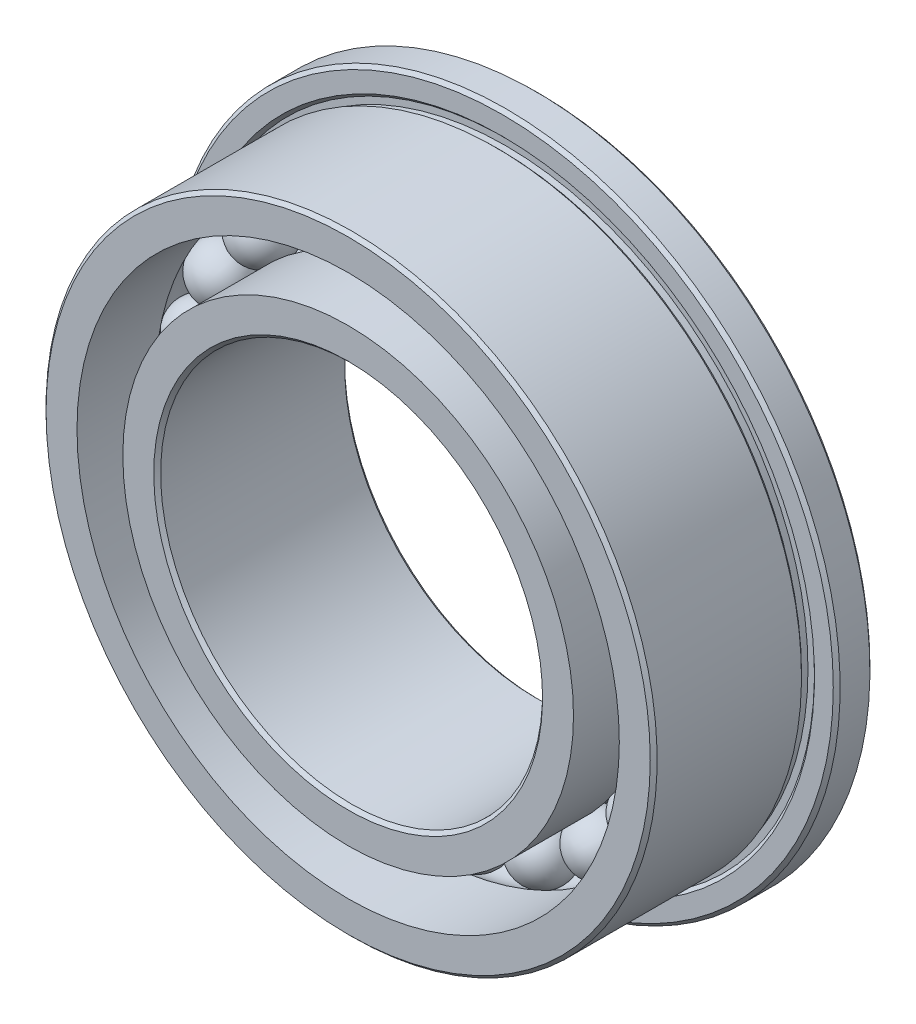
ISO-10303-21;
HEADER;
FILE_DESCRIPTION(('STEP AP214'),'2;1');
FILE_NAME('part.step','',(''),(''),'','','');
FILE_SCHEMA(('AUTOMOTIVE_DESIGN { 1 0 10303 214 1 1 1 1 }'));
ENDSEC;
DATA;
#1=APPLICATION_CONTEXT('core data for automotive mechanical design processes');
#2=APPLICATION_PROTOCOL_DEFINITION('international standard','automotive_design',2000,#1);
#3=PRODUCT_CONTEXT('',#1,'mechanical');
#4=PRODUCT('Part','Part','',(#3));
#5=PRODUCT_RELATED_PRODUCT_CATEGORY('part','',(#4));
#6=PRODUCT_DEFINITION_FORMATION('','',#4);
#7=PRODUCT_DEFINITION_CONTEXT('part definition',#1,'design');
#8=PRODUCT_DEFINITION('design','',#6,#7);
#9=PRODUCT_DEFINITION_SHAPE('','',#8);
#10=(LENGTH_UNIT() NAMED_UNIT(*) SI_UNIT(.MILLI.,.METRE.));
#11=(NAMED_UNIT(*) PLANE_ANGLE_UNIT() SI_UNIT($,.RADIAN.));
#12=(NAMED_UNIT(*) SI_UNIT($,.STERADIAN.) SOLID_ANGLE_UNIT());
#13=UNCERTAINTY_MEASURE_WITH_UNIT(LENGTH_MEASURE(1.E-05),#10,'distance_accuracy_value','');
#14=(GEOMETRIC_REPRESENTATION_CONTEXT(3) GLOBAL_UNCERTAINTY_ASSIGNED_CONTEXT((#13)) GLOBAL_UNIT_ASSIGNED_CONTEXT((#10,
#11,#12)) REPRESENTATION_CONTEXT('',''));
#15=CARTESIAN_POINT('',(0.,0.,0.));
#16=DIRECTION('',(0.,0.,1.));
#17=DIRECTION('',(1.,0.,0.));
#18=AXIS2_PLACEMENT_3D('',#15,#16,#17);
#19=CARTESIAN_POINT('',(-1.39198271618821,4.96805137941007,0.));
#20=DIRECTION('',(-0.269796771157012,0.962917287347803,0.));
#21=DIRECTION('',(0.962917287347803,0.269796771157012,0.));
#22=AXIS2_PLACEMENT_3D('',#19,#20,#21);
#23=SPHERICAL_SURFACE('',#22,0.5953125);
#24=CARTESIAN_POINT('',(-1.55259610651762,5.54128807703431,0.));
#25=VERTEX_POINT('',#24);
#26=VERTEX_LOOP('',#25);
#27=FACE_BOUND('',#26,.T.);
#28=ADVANCED_FACE('F48',(#27),#23,.T.);
#29=CLOSED_SHELL('',(#28));
#30=MANIFOLD_SOLID_BREP('B2',#29);
#31=CARTESIAN_POINT('',(-2.68072844221401,4.40827011533207,0.));
#32=DIRECTION('',(-0.519583950035423,0.854419404546495,0.));
#33=DIRECTION('',(0.854419404546495,0.519583950035423,0.));
#34=AXIS2_PLACEMENT_3D('',#31,#32,#33);
#35=SPHERICAL_SURFACE('',#34,0.5953125);
#36=CARTESIAN_POINT('',(-2.99004326246947,4.91691666710116,0.));
#37=VERTEX_POINT('',#36);
#38=VERTEX_LOOP('',#37);
#39=FACE_BOUND('',#38,.T.);
#40=ADVANCED_FACE('F67',(#39),#35,.T.);
#41=CLOSED_SHELL('',(#40));
#42=MANIFOLD_SOLID_BREP('B7',#41);
#43=CARTESIAN_POINT('',(-3.77065680319741,3.52154762329379,0.));
#44=DIRECTION('',(-0.730835964278116,0.682553143218662,0.));
#45=DIRECTION('',(0.682553143218662,0.730835964278116,0.));
#46=AXIS2_PLACEMENT_3D('',#43,#44,#45);
#47=SPHERICAL_SURFACE('',#46,0.5953125);
#48=CARTESIAN_POINT('',(-4.20573258818172,3.92788004136615,0.));
#49=VERTEX_POINT('',#48);
#50=VERTEX_LOOP('',#49);
#51=FACE_BOUND('',#50,.T.);
#52=ADVANCED_FACE('F86',(#51),#47,.T.);
#53=CLOSED_SHELL('',(#52));
#54=MANIFOLD_SOLID_BREP('B44',#53);
#55=CARTESIAN_POINT('',(-4.58093279869473,2.37364805404421,0.));
#56=DIRECTION('',(-0.88788521840237,0.460065037731162,0.));
#57=DIRECTION('',(0.460065037731162,0.88788521840237,0.));
#58=AXIS2_PLACEMENT_3D('',#55,#56,#57);
#59=SPHERICAL_SURFACE('',#58,0.5953125);
#60=CARTESIAN_POINT('',(-5.10950196777489,2.64753052181855,0.));
#61=VERTEX_POINT('',#60);
#62=VERTEX_LOOP('',#61);
#63=FACE_BOUND('',#62,.T.);
#64=ADVANCED_FACE('F105',(#63),#59,.T.);
#65=CLOSED_SHELL('',(#64));
#66=MANIFOLD_SOLID_BREP('B63',#65);
#67=CARTESIAN_POINT('',(-5.05146196488597,1.04970586734349,0.));
#68=DIRECTION('',(-0.979084087682321,0.203456013052645,0.));
#69=DIRECTION('',(0.203456013052645,0.979084087682321,0.));
#70=AXIS2_PLACEMENT_3D('',#67,#68,#69);
#71=SPHERICAL_SURFACE('',#70,0.5953125);
#72=CARTESIAN_POINT('',(-5.63432296083436,1.17082577511389,0.));
#73=VERTEX_POINT('',#72);
#74=VERTEX_LOOP('',#73);
#75=FACE_BOUND('',#74,.T.);
#76=ADVANCED_FACE('F124',(#75),#71,.T.);
#77=CLOSED_SHELL('',(#76));
#78=MANIFOLD_SOLID_BREP('B82',#77);
#79=CARTESIAN_POINT('',(-5.14734730604244,-0.352088201453296,0.));
#80=DIRECTION('',(-0.99766876919054,-0.0682424133646608,0.));
#81=DIRECTION('',(-0.0682424133646608,0.99766876919054,0.));
#82=AXIS2_PLACEMENT_3D('',#79,#80,#81);
#83=SPHERICAL_SURFACE('',#82,0.5953125);
#84=CARTESIAN_POINT('',(-5.74127199520119,-0.392713763159446,0.));
#85=VERTEX_POINT('',#84);
#86=VERTEX_LOOP('',#85);
#87=FACE_BOUND('',#86,.T.);
#88=ADVANCED_FACE('F144',(#87),#83,.T.);
#89=CLOSED_SHELL('',(#88));
#90=MANIFOLD_SOLID_BREP('B101',#89);
#91=CARTESIAN_POINT('',(-4.86147744505681,-1.72776949904464,0.));
#92=DIRECTION('',(-0.942260922118824,-0.334879612170977,0.));
#93=DIRECTION('',(-0.334879612170977,0.942260922118824,0.));
#94=AXIS2_PLACEMENT_3D('',#91,#92,#93);
#95=SPHERICAL_SURFACE('',#94,0.5953125);
#96=CARTESIAN_POINT('',(-5.42241715025567,-1.92712751816517,0.));
#97=VERTEX_POINT('',#96);
#98=VERTEX_LOOP('',#97);
#99=FACE_BOUND('',#98,.T.);
#100=ADVANCED_FACE('F163',(#99),#95,.T.);
#101=CLOSED_SHELL('',(#100));
#102=MANIFOLD_SOLID_BREP('B120',#101);
#103=CARTESIAN_POINT('',(-4.21505404175078,-2.97531003691136,0.));
#104=DIRECTION('',(-0.816969893010447,-0.57668032211486,0.));
#105=DIRECTION('',(-0.57668032211486,0.816969893010447,0.));
#106=AXIS2_PLACEMENT_3D('',#103,#104,#105);
#107=SPHERICAL_SURFACE('',#106,0.5953125);
#108=CARTESIAN_POINT('',(-4.70140643118356,-3.31861504117036,0.));
#109=VERTEX_POINT('',#108);
#110=VERTEX_LOOP('',#109);
#111=FACE_BOUND('',#110,.T.);
#112=ADVANCED_FACE('F183',(#111),#107,.T.);
#113=CLOSED_SHELL('',(#112));
#114=MANIFOLD_SOLID_BREP('B140',#113);
#115=CARTESIAN_POINT('',(-3.25601936275726,-4.00218544047809,0.));
#116=DIRECTION('',(-0.631087944326059,-0.775711290704415,0.));
#117=DIRECTION('',(-0.775711290704415,0.631087944326059,0.));
#118=AXIS2_PLACEMENT_3D('',#115,#116,#117);
#119=SPHERICAL_SURFACE('',#118,0.5953125);
#120=CARTESIAN_POINT('',(-3.63171390461387,-4.46397606822556,0.));
#121=VERTEX_POINT('',#120);
#122=VERTEX_LOOP('',#121);
#123=FACE_BOUND('',#122,.T.);
#124=ADVANCED_FACE('F202',(#123),#119,.T.);
#125=CLOSED_SHELL('',(#124));
#126=MANIFOLD_SOLID_BREP('B159',#125);
#127=CARTESIAN_POINT('',(-2.05550062292549,-4.73223705870468,0.));
#128=DIRECTION('',(-0.398401089846249,-0.91721130150545,0.));
#129=DIRECTION('',(-0.91721130150545,0.398401089846249,0.));
#130=AXIS2_PLACEMENT_3D('',#127,#128,#129);
#131=SPHERICAL_SURFACE('',#130,0.5953125);
#132=CARTESIAN_POINT('',(-2.29267377172458,-5.27826441163215,0.));
#133=VERTEX_POINT('',#132);
#134=VERTEX_LOOP('',#133);
#135=FACE_BOUND('',#134,.T.);
#136=ADVANCED_FACE('F221',(#135),#131,.T.);
#137=CLOSED_SHELL('',(#136));
#138=MANIFOLD_SOLID_BREP('B179',#137);
#139=CARTESIAN_POINT('',(-0.702534805180985,-5.11132030283119,0.));
#140=DIRECTION('',(-0.136166649096254,-0.99068594603633,0.));
#141=DIRECTION('',(-0.99068594603633,0.136166649096254,0.));
#142=AXIS2_PLACEMENT_3D('',#139,#140,#141);
#143=SPHERICAL_SURFACE('',#142,0.5953125);
#144=CARTESIAN_POINT('',(-0.783596513471099,-5.70108803008094,0.));
#145=VERTEX_POINT('',#144);
#146=VERTEX_LOOP('',#145);
#147=FACE_BOUND('',#146,.T.);
#148=ADVANCED_FACE('F241',(#147),#143,.T.);
#149=CLOSED_SHELL('',(#148));
#150=MANIFOLD_SOLID_BREP('B198',#149);
#151=CARTESIAN_POINT('',(0.702534805180913,-5.1113203028312,0.));
#152=DIRECTION('',(0.13616664909624,-0.990685946036332,0.));
#153=DIRECTION('',(-0.990685946036332,-0.13616664909624,0.));
#154=AXIS2_PLACEMENT_3D('',#151,#152,#153);
#155=SPHERICAL_SURFACE('',#154,0.5953125);
#156=CARTESIAN_POINT('',(0.783596513471019,-5.70108803008095,0.));
#157=VERTEX_POINT('',#156);
#158=VERTEX_LOOP('',#157);
#159=FACE_BOUND('',#158,.T.);
#160=ADVANCED_FACE('F260',(#159),#155,.T.);
#161=CLOSED_SHELL('',(#160));
#162=MANIFOLD_SOLID_BREP('B217',#161);
#163=CARTESIAN_POINT('',(2.05550062292542,-4.73223705870471,0.));
#164=DIRECTION('',(0.398401089846236,-0.917211301505455,0.));
#165=DIRECTION('',(-0.917211301505455,-0.398401089846236,0.));
#166=AXIS2_PLACEMENT_3D('',#163,#164,#165);
#167=SPHERICAL_SURFACE('',#166,0.5953125);
#168=CARTESIAN_POINT('',(2.29267377172451,-5.27826441163218,0.));
#169=VERTEX_POINT('',#168);
#170=VERTEX_LOOP('',#169);
#171=FACE_BOUND('',#170,.T.);
#172=ADVANCED_FACE('F279',(#171),#167,.T.);
#173=CLOSED_SHELL('',(#172));
#174=MANIFOLD_SOLID_BREP('B237',#173);
#175=CARTESIAN_POINT('',(3.25601936275721,-4.00218544047813,0.));
#176=DIRECTION('',(0.631087944326049,-0.775711290704423,0.));
#177=DIRECTION('',(-0.775711290704423,-0.631087944326049,0.));
#178=AXIS2_PLACEMENT_3D('',#175,#176,#177);
#179=SPHERICAL_SURFACE('',#178,0.5953125);
#180=CARTESIAN_POINT('',(3.63171390461381,-4.46397606822561,0.));
#181=VERTEX_POINT('',#180);
#182=VERTEX_LOOP('',#181);
#183=FACE_BOUND('',#182,.T.);
#184=ADVANCED_FACE('F298',(#183),#179,.T.);
#185=CLOSED_SHELL('',(#184));
#186=MANIFOLD_SOLID_BREP('B256',#185);
#187=CARTESIAN_POINT('',(4.21505404175073,-2.97531003691141,0.));
#188=DIRECTION('',(0.816969893010439,-0.576680322114871,0.));
#189=DIRECTION('',(-0.576680322114871,-0.816969893010439,0.));
#190=AXIS2_PLACEMENT_3D('',#187,#188,#189);
#191=SPHERICAL_SURFACE('',#190,0.5953125);
#192=CARTESIAN_POINT('',(4.70140643118351,-3.31861504117042,0.));
#193=VERTEX_POINT('',#192);
#194=VERTEX_LOOP('',#193);
#195=FACE_BOUND('',#194,.T.);
#196=ADVANCED_FACE('F317',(#195),#191,.T.);
#197=CLOSED_SHELL('',(#196));
#198=MANIFOLD_SOLID_BREP('B275',#197);
#199=CARTESIAN_POINT('',(4.86147744505678,-1.7277694990447,0.));
#200=DIRECTION('',(0.942260922118819,-0.33487961217099,0.));
#201=DIRECTION('',(-0.33487961217099,-0.942260922118819,0.));
#202=AXIS2_PLACEMENT_3D('',#199,#200,#201);
#203=SPHERICAL_SURFACE('',#202,0.5953125);
#204=CARTESIAN_POINT('',(5.42241715025564,-1.92712751816524,0.));
#205=VERTEX_POINT('',#204);
#206=VERTEX_LOOP('',#205);
#207=FACE_BOUND('',#206,.T.);
#208=ADVANCED_FACE('F336',(#207),#203,.T.);
#209=CLOSED_SHELL('',(#208));
#210=MANIFOLD_SOLID_BREP('B294',#209);
#211=CARTESIAN_POINT('',(5.14734730604244,-0.352088201453368,0.));
#212=DIRECTION('',(0.997668769190539,-0.0682424133646746,0.));
#213=DIRECTION('',(-0.0682424133646746,-0.997668769190539,0.));
#214=AXIS2_PLACEMENT_3D('',#211,#212,#213);
#215=SPHERICAL_SURFACE('',#214,0.5953125);
#216=CARTESIAN_POINT('',(5.74127199520118,-0.392713763159526,0.));
#217=VERTEX_POINT('',#216);
#218=VERTEX_LOOP('',#217);
#219=FACE_BOUND('',#218,.T.);
#220=ADVANCED_FACE('F355',(#219),#215,.T.);
#221=CLOSED_SHELL('',(#220));
#222=MANIFOLD_SOLID_BREP('B313',#221);
#223=CARTESIAN_POINT('',(5.05146196488599,1.04970586734342,0.));
#224=DIRECTION('',(0.979084087682323,0.203456013052631,0.));
#225=DIRECTION('',(0.203456013052631,-0.979084087682323,0.));
#226=AXIS2_PLACEMENT_3D('',#223,#224,#225);
#227=SPHERICAL_SURFACE('',#226,0.5953125);
#228=CARTESIAN_POINT('',(5.63432296083437,1.17082577511381,0.));
#229=VERTEX_POINT('',#228);
#230=VERTEX_LOOP('',#229);
#231=FACE_BOUND('',#230,.T.);
#232=ADVANCED_FACE('F374',(#231),#227,.T.);
#233=CLOSED_SHELL('',(#232));
#234=MANIFOLD_SOLID_BREP('B332',#233);
#235=CARTESIAN_POINT('',(4.58093279869476,2.37364805404415,0.));
#236=DIRECTION('',(0.887885218402376,0.46006503773115,0.));
#237=DIRECTION('',(0.46006503773115,-0.887885218402376,0.));
#238=AXIS2_PLACEMENT_3D('',#235,#236,#237);
#239=SPHERICAL_SURFACE('',#238,0.5953125);
#240=CARTESIAN_POINT('',(5.10950196777492,2.64753052181848,0.));
#241=VERTEX_POINT('',#240);
#242=VERTEX_LOOP('',#241);
#243=FACE_BOUND('',#242,.T.);
#244=ADVANCED_FACE('F393',(#243),#239,.T.);
#245=CLOSED_SHELL('',(#244));
#246=MANIFOLD_SOLID_BREP('B351',#245);
#247=CARTESIAN_POINT('',(3.77065680319745,3.52154762329374,0.));
#248=DIRECTION('',(0.730835964278125,0.682553143218653,0.));
#249=DIRECTION('',(0.682553143218653,-0.730835964278125,0.));
#250=AXIS2_PLACEMENT_3D('',#247,#248,#249);
#251=SPHERICAL_SURFACE('',#250,0.5953125);
#252=CARTESIAN_POINT('',(4.20573258818178,3.92788004136609,0.));
#253=VERTEX_POINT('',#252);
#254=VERTEX_LOOP('',#253);
#255=FACE_BOUND('',#254,.T.);
#256=ADVANCED_FACE('F412',(#255),#251,.T.);
#257=CLOSED_SHELL('',(#256));
#258=MANIFOLD_SOLID_BREP('B370',#257);
#259=CARTESIAN_POINT('',(2.68072844221407,4.40827011533204,0.));
#260=DIRECTION('',(0.519583950035434,0.854419404546488,0.));
#261=DIRECTION('',(0.854419404546488,-0.519583950035434,0.));
#262=AXIS2_PLACEMENT_3D('',#259,#260,#261);
#263=SPHERICAL_SURFACE('',#262,0.5953125);
#264=CARTESIAN_POINT('',(2.99004326246954,4.91691666710112,0.));
#265=VERTEX_POINT('',#264);
#266=VERTEX_LOOP('',#265);
#267=FACE_BOUND('',#266,.T.);
#268=ADVANCED_FACE('F431',(#267),#263,.T.);
#269=CLOSED_SHELL('',(#268));
#270=MANIFOLD_SOLID_BREP('B389',#269);
#271=CARTESIAN_POINT('',(1.39198271618827,4.96805137941005,0.));
#272=DIRECTION('',(0.269796771157025,0.962917287347799,0.));
#273=DIRECTION('',(0.962917287347799,-0.269796771157025,0.));
#274=AXIS2_PLACEMENT_3D('',#271,#272,#273);
#275=SPHERICAL_SURFACE('',#274,0.5953125);
#276=CARTESIAN_POINT('',(1.55259610651769,5.54128807703429,0.));
#277=VERTEX_POINT('',#276);
#278=VERTEX_LOOP('',#277);
#279=FACE_BOUND('',#278,.T.);
#280=ADVANCED_FACE('F450',(#279),#275,.T.);
#281=CLOSED_SHELL('',(#280));
#282=MANIFOLD_SOLID_BREP('B408',#281);
#283=CARTESIAN_POINT('',(0.,5.159375,0.));
#284=DIRECTION('',(0.,1.,0.));
#285=DIRECTION('',(1.,0.,0.));
#286=AXIS2_PLACEMENT_3D('',#283,#284,#285);
#287=SPHERICAL_SURFACE('',#286,0.5953125);
#288=CARTESIAN_POINT('',(0.,5.7546875,0.));
#289=VERTEX_POINT('',#288);
#290=VERTEX_LOOP('',#289);
#291=FACE_BOUND('',#290,.T.);
#292=ADVANCED_FACE('F473',(#291),#287,.T.);
#293=CLOSED_SHELL('',(#292));
#294=MANIFOLD_SOLID_BREP('B427',#293);
#295=CARTESIAN_POINT('',(0.,0.,0.));
#296=DIRECTION('',(0.,0.,1.));
#297=DIRECTION('',(0.,-1.,0.));
#298=AXIS2_PLACEMENT_3D('',#295,#296,#297);
#299=CYLINDRICAL_SURFACE('',#298,4.683125);
#300=CARTESIAN_POINT('',(0.,0.,-0.3571875));
#301=DIRECTION('',(0.,0.,1.));
#302=DIRECTION('',(0.,-1.,0.));
#303=AXIS2_PLACEMENT_3D('',#300,#301,#302);
#304=CIRCLE('',#303,4.683125);
#305=CARTESIAN_POINT('',(0.,-4.683125,-0.3571875));
#306=VERTEX_POINT('',#305);
#307=EDGE_CURVE('E520',#306,#306,#304,.T.);
#308=ORIENTED_EDGE('',*,*,#307,.F.);
#309=EDGE_LOOP('',(#308));
#310=FACE_BOUND('',#309,.T.);
#311=CARTESIAN_POINT('',(0.,0.,-1.984375));
#312=DIRECTION('',(0.,0.,1.));
#313=DIRECTION('',(0.,-1.,0.));
#314=AXIS2_PLACEMENT_3D('',#311,#312,#313);
#315=CIRCLE('',#314,4.683125);
#316=CARTESIAN_POINT('',(0.,-4.683125,-1.984375));
#317=VERTEX_POINT('',#316);
#318=EDGE_CURVE('E531',#317,#317,#315,.T.);
#319=ORIENTED_EDGE('',*,*,#318,.T.);
#320=EDGE_LOOP('',(#319));
#321=FACE_BOUND('',#320,.T.);
#322=ADVANCED_FACE('F495',(#310,#321),#299,.T.);
#323=CARTESIAN_POINT('',(0.,0.,0.));
#324=DIRECTION('',(0.,0.,1.));
#325=DIRECTION('',(0.,-1.,0.));
#326=AXIS2_PLACEMENT_3D('',#323,#324,#325);
#327=TOROIDAL_SURFACE('',#326,5.159375,0.5953125);
#328=CARTESIAN_POINT('',(0.,0.,0.3571875));
#329=DIRECTION('',(0.,0.,1.));
#330=DIRECTION('',(0.,-1.,0.));
#331=AXIS2_PLACEMENT_3D('',#328,#329,#330);
#332=CIRCLE('',#331,4.683125);
#333=CARTESIAN_POINT('',(0.,-4.683125,0.357187499999999));
#334=VERTEX_POINT('',#333);
#335=EDGE_CURVE('E524',#334,#334,#332,.T.);
#336=ORIENTED_EDGE('',*,*,#335,.F.);
#337=EDGE_LOOP('',(#336));
#338=FACE_BOUND('',#337,.T.);
#339=ORIENTED_EDGE('',*,*,#307,.T.);
#340=EDGE_LOOP('',(#339));
#341=FACE_BOUND('',#340,.T.);
#342=ADVANCED_FACE('F551',(#338,#341),#327,.F.);
#343=CARTESIAN_POINT('',(0.,0.,0.));
#344=DIRECTION('',(0.,0.,1.));
#345=DIRECTION('',(0.,-1.,0.));
#346=AXIS2_PLACEMENT_3D('',#343,#344,#345);
#347=CYLINDRICAL_SURFACE('',#346,4.683125);
#348=CARTESIAN_POINT('',(0.,0.,1.984375));
#349=DIRECTION('',(0.,0.,1.));
#350=DIRECTION('',(0.,-1.,0.));
#351=AXIS2_PLACEMENT_3D('',#348,#349,#350);
#352=CIRCLE('',#351,4.683125);
#353=CARTESIAN_POINT('',(0.,-4.683125,1.984375));
#354=VERTEX_POINT('',#353);
#355=EDGE_CURVE('E528',#354,#354,#352,.T.);
#356=ORIENTED_EDGE('',*,*,#355,.F.);
#357=EDGE_LOOP('',(#356));
#358=FACE_BOUND('',#357,.T.);
#359=ORIENTED_EDGE('',*,*,#335,.T.);
#360=EDGE_LOOP('',(#359));
#361=FACE_BOUND('',#360,.T.);
#362=ADVANCED_FACE('F557',(#358,#361),#347,.T.);
#363=CARTESIAN_POINT('',(0.,3.96875,1.984375));
#364=DIRECTION('',(0.,0.,-1.));
#365=DIRECTION('',(0.,1.,0.));
#366=AXIS2_PLACEMENT_3D('',#363,#364,#365);
#367=PLANE('',#366);
#368=CARTESIAN_POINT('',(0.,0.,1.984375));
#369=DIRECTION('',(0.,0.,-1.));
#370=DIRECTION('',(0.,1.,0.));
#371=AXIS2_PLACEMENT_3D('',#368,#369,#370);
#372=CIRCLE('',#371,4.0401875);
#373=CARTESIAN_POINT('',(0.,4.0401875,1.984375));
#374=VERTEX_POINT('',#373);
#375=EDGE_CURVE('E472',#374,#374,#372,.T.);
#376=ORIENTED_EDGE('',*,*,#375,.T.);
#377=EDGE_LOOP('',(#376));
#378=FACE_BOUND('',#377,.T.);
#379=ORIENTED_EDGE('',*,*,#355,.T.);
#380=EDGE_LOOP('',(#379));
#381=FACE_BOUND('',#380,.T.);
#382=ADVANCED_FACE('F548',(#378,#381),#367,.F.);
#383=CARTESIAN_POINT('',(0.,0.,0.));
#384=DIRECTION('',(0.,0.,1.));
#385=DIRECTION('',(0.,-1.,0.));
#386=AXIS2_PLACEMENT_3D('',#383,#384,#385);
#387=CYLINDRICAL_SURFACE('',#386,3.96875);
#388=CARTESIAN_POINT('',(0.,0.,-1.9129375));
#389=DIRECTION('',(0.,0.,1.));
#390=DIRECTION('',(0.,-1.,0.));
#391=AXIS2_PLACEMENT_3D('',#388,#389,#390);
#392=CIRCLE('',#391,3.96875);
#393=CARTESIAN_POINT('',(0.,-3.96875,-1.9129375));
#394=VERTEX_POINT('',#393);
#395=EDGE_CURVE('E503',#394,#394,#392,.F.);
#396=ORIENTED_EDGE('',*,*,#395,.T.);
#397=EDGE_LOOP('',(#396));
#398=FACE_BOUND('',#397,.T.);
#399=CARTESIAN_POINT('',(0.,0.,1.9129375));
#400=DIRECTION('',(0.,0.,-1.));
#401=DIRECTION('',(0.,1.,0.));
#402=AXIS2_PLACEMENT_3D('',#399,#400,#401);
#403=CIRCLE('',#402,3.96875);
#404=CARTESIAN_POINT('',(0.,3.96875,1.9129375));
#405=VERTEX_POINT('',#404);
#406=EDGE_CURVE('E510',#405,#405,#403,.F.);
#407=ORIENTED_EDGE('',*,*,#406,.T.);
#408=EDGE_LOOP('',(#407));
#409=FACE_BOUND('',#408,.T.);
#410=ADVANCED_FACE('F540',(#398,#409),#387,.F.);
#411=CARTESIAN_POINT('',(0.,4.683125,-1.984375));
#412=DIRECTION('',(0.,0.,1.));
#413=DIRECTION('',(0.,-1.,0.));
#414=AXIS2_PLACEMENT_3D('',#411,#412,#413);
#415=PLANE('',#414);
#416=CARTESIAN_POINT('',(0.,0.,-1.984375));
#417=DIRECTION('',(0.,0.,1.));
#418=DIRECTION('',(0.,-1.,0.));
#419=AXIS2_PLACEMENT_3D('',#416,#417,#418);
#420=CIRCLE('',#419,4.0401875);
#421=CARTESIAN_POINT('',(0.,-4.0401875,-1.984375));
#422=VERTEX_POINT('',#421);
#423=EDGE_CURVE('E515',#422,#422,#420,.T.);
#424=ORIENTED_EDGE('',*,*,#423,.T.);
#425=EDGE_LOOP('',(#424));
#426=FACE_BOUND('',#425,.T.);
#427=ORIENTED_EDGE('',*,*,#318,.F.);
#428=EDGE_LOOP('',(#427));
#429=FACE_BOUND('',#428,.T.);
#430=ADVANCED_FACE('F537',(#426,#429),#415,.F.);
#431=CARTESIAN_POINT('',(0.,0.,-1.984375));
#432=DIRECTION('',(0.,0.,-1.));
#433=DIRECTION('',(0.,1.,0.));
#434=AXIS2_PLACEMENT_3D('',#431,#432,#433);
#435=CONICAL_SURFACE('',#434,4.0401875,0.78539816339745);
#436=ORIENTED_EDGE('',*,*,#395,.F.);
#437=EDGE_LOOP('',(#436));
#438=FACE_BOUND('',#437,.T.);
#439=ORIENTED_EDGE('',*,*,#423,.F.);
#440=EDGE_LOOP('',(#439));
#441=FACE_BOUND('',#440,.T.);
#442=ADVANCED_FACE('F539',(#438,#441),#435,.F.);
#443=CARTESIAN_POINT('',(0.,0.,1.9129375));
#444=DIRECTION('',(0.,0.,1.));
#445=DIRECTION('',(0.,-1.,0.));
#446=AXIS2_PLACEMENT_3D('',#443,#444,#445);
#447=CONICAL_SURFACE('',#446,3.96875,0.78539816339745);
#448=ORIENTED_EDGE('',*,*,#375,.F.);
#449=EDGE_LOOP('',(#448));
#450=FACE_BOUND('',#449,.T.);
#451=ORIENTED_EDGE('',*,*,#406,.F.);
#452=EDGE_LOOP('',(#451));
#453=FACE_BOUND('',#452,.T.);
#454=ADVANCED_FACE('F497',(#450,#453),#447,.F.);
#455=CLOSED_SHELL('',(#322,#342,#362,#382,#410,#430,#442,#454));
#456=MANIFOLD_SOLID_BREP('B446',#455);
#457=CARTESIAN_POINT('',(0.,5.635625,-1.984375));
#458=DIRECTION('',(0.,0.,1.));
#459=DIRECTION('',(0.,-1.,0.));
#460=AXIS2_PLACEMENT_3D('',#457,#458,#459);
#461=PLANE('',#460);
#462=CARTESIAN_POINT('',(0.,0.,-1.984375));
#463=DIRECTION('',(0.,0.,1.));
#464=DIRECTION('',(0.,-1.,0.));
#465=AXIS2_PLACEMENT_3D('',#462,#463,#464);
#466=CIRCLE('',#465,6.8754625);
#467=CARTESIAN_POINT('',(0.,-6.8754625,-1.984375));
#468=VERTEX_POINT('',#467);
#469=EDGE_CURVE('E654',#468,#468,#466,.F.);
#470=ORIENTED_EDGE('',*,*,#469,.T.);
#471=EDGE_LOOP('',(#470));
#472=FACE_BOUND('',#471,.T.);
#473=CARTESIAN_POINT('',(0.,0.,-1.984375));
#474=DIRECTION('',(0.,0.,1.));
#475=DIRECTION('',(0.,-1.,0.));
#476=AXIS2_PLACEMENT_3D('',#473,#474,#475);
#477=CIRCLE('',#476,5.635625);
#478=CARTESIAN_POINT('',(0.,-5.635625,-1.984375));
#479=VERTEX_POINT('',#478);
#480=EDGE_CURVE('E667',#479,#479,#477,.T.);
#481=ORIENTED_EDGE('',*,*,#480,.T.);
#482=EDGE_LOOP('',(#481));
#483=FACE_BOUND('',#482,.T.);
#484=ADVANCED_FACE('F634',(#472,#483),#461,.F.);
#485=CARTESIAN_POINT('',(0.,0.,0.));
#486=DIRECTION('',(0.,0.,1.));
#487=DIRECTION('',(0.,-1.,0.));
#488=AXIS2_PLACEMENT_3D('',#485,#486,#487);
#489=CYLINDRICAL_SURFACE('',#488,5.635625);
#490=ORIENTED_EDGE('',*,*,#480,.F.);
#491=EDGE_LOOP('',(#490));
#492=FACE_BOUND('',#491,.T.);
#493=CARTESIAN_POINT('',(0.,0.,-0.3571875));
#494=DIRECTION('',(0.,0.,1.));
#495=DIRECTION('',(0.,-1.,0.));
#496=AXIS2_PLACEMENT_3D('',#493,#494,#495);
#497=CIRCLE('',#496,5.635625);
#498=CARTESIAN_POINT('',(0.,-5.635625,-0.3571875));
#499=VERTEX_POINT('',#498);
#500=EDGE_CURVE('E671',#499,#499,#497,.T.);
#501=ORIENTED_EDGE('',*,*,#500,.T.);
#502=EDGE_LOOP('',(#501));
#503=FACE_BOUND('',#502,.T.);
#504=ADVANCED_FACE('F721',(#492,#503),#489,.F.);
#505=CARTESIAN_POINT('',(0.,0.,0.));
#506=DIRECTION('',(0.,0.,1.));
#507=DIRECTION('',(0.,-1.,0.));
#508=AXIS2_PLACEMENT_3D('',#505,#506,#507);
#509=TOROIDAL_SURFACE('',#508,5.159375,0.5953125);
#510=ORIENTED_EDGE('',*,*,#500,.F.);
#511=EDGE_LOOP('',(#510));
#512=FACE_BOUND('',#511,.T.);
#513=CARTESIAN_POINT('',(0.,0.,0.3571875));
#514=DIRECTION('',(0.,0.,1.));
#515=DIRECTION('',(0.,-1.,0.));
#516=AXIS2_PLACEMENT_3D('',#513,#514,#515);
#517=CIRCLE('',#516,5.635625);
#518=CARTESIAN_POINT('',(0.,-5.635625,0.357187499999999));
#519=VERTEX_POINT('',#518);
#520=EDGE_CURVE('E675',#519,#519,#517,.T.);
#521=ORIENTED_EDGE('',*,*,#520,.T.);
#522=EDGE_LOOP('',(#521));
#523=FACE_BOUND('',#522,.T.);
#524=ADVANCED_FACE('F727',(#512,#523),#509,.F.);
#525=CARTESIAN_POINT('',(0.,0.,0.));
#526=DIRECTION('',(0.,0.,1.));
#527=DIRECTION('',(0.,-1.,0.));
#528=AXIS2_PLACEMENT_3D('',#525,#526,#527);
#529=CYLINDRICAL_SURFACE('',#528,5.635625);
#530=ORIENTED_EDGE('',*,*,#520,.F.);
#531=EDGE_LOOP('',(#530));
#532=FACE_BOUND('',#531,.T.);
#533=CARTESIAN_POINT('',(0.,0.,1.984375));
#534=DIRECTION('',(0.,0.,1.));
#535=DIRECTION('',(0.,-1.,0.));
#536=AXIS2_PLACEMENT_3D('',#533,#534,#535);
#537=CIRCLE('',#536,5.635625);
#538=CARTESIAN_POINT('',(0.,-5.635625,1.984375));
#539=VERTEX_POINT('',#538);
#540=EDGE_CURVE('E679',#539,#539,#537,.T.);
#541=ORIENTED_EDGE('',*,*,#540,.T.);
#542=EDGE_LOOP('',(#541));
#543=FACE_BOUND('',#542,.T.);
#544=ADVANCED_FACE('F807',(#532,#543),#529,.F.);
#545=CARTESIAN_POINT('',(0.,6.35,1.984375));
#546=DIRECTION('',(0.,0.,-1.));
#547=DIRECTION('',(0.,1.,0.));
#548=AXIS2_PLACEMENT_3D('',#545,#546,#547);
#549=PLANE('',#548);
#550=CARTESIAN_POINT('',(0.,0.,1.984375));
#551=DIRECTION('',(0.,0.,-1.));
#552=DIRECTION('',(0.,1.,0.));
#553=AXIS2_PLACEMENT_3D('',#550,#551,#552);
#554=CIRCLE('',#553,6.2785625);
#555=CARTESIAN_POINT('',(0.,6.2785625,1.984375));
#556=VERTEX_POINT('',#555);
#557=EDGE_CURVE('E642',#556,#556,#554,.F.);
#558=ORIENTED_EDGE('',*,*,#557,.T.);
#559=EDGE_LOOP('',(#558));
#560=FACE_BOUND('',#559,.T.);
#561=ORIENTED_EDGE('',*,*,#540,.F.);
#562=EDGE_LOOP('',(#561));
#563=FACE_BOUND('',#562,.T.);
#564=ADVANCED_FACE('F753',(#560,#563),#549,.F.);
#565=CARTESIAN_POINT('',(0.,0.,0.));
#566=DIRECTION('',(0.,0.,1.));
#567=DIRECTION('',(0.,-1.,0.));
#568=AXIS2_PLACEMENT_3D('',#565,#566,#567);
#569=CYLINDRICAL_SURFACE('',#568,6.35);
#570=CARTESIAN_POINT('',(0.,0.,1.9129375));
#571=DIRECTION('',(0.,0.,-1.));
#572=DIRECTION('',(0.,1.,0.));
#573=AXIS2_PLACEMENT_3D('',#570,#571,#572);
#574=CIRCLE('',#573,6.35);
#575=CARTESIAN_POINT('',(0.,6.35,1.9129375));
#576=VERTEX_POINT('',#575);
#577=EDGE_CURVE('E494',#576,#576,#574,.T.);
#578=ORIENTED_EDGE('',*,*,#577,.T.);
#579=EDGE_LOOP('',(#578));
#580=FACE_BOUND('',#579,.T.);
#581=CARTESIAN_POINT('',(0.,0.,-1.08767115818396));
#582=DIRECTION('',(0.,0.,1.));
#583=DIRECTION('',(0.,-1.,0.));
#584=AXIS2_PLACEMENT_3D('',#581,#582,#583);
#585=CIRCLE('',#584,6.35);
#586=CARTESIAN_POINT('',(0.,-6.35,-1.08767115818396));
#587=VERTEX_POINT('',#586);
#588=EDGE_CURVE('E682',#587,#587,#585,.T.);
#589=ORIENTED_EDGE('',*,*,#588,.T.);
#590=EDGE_LOOP('',(#589));
#591=FACE_BOUND('',#590,.T.);
#592=ADVANCED_FACE('F779',(#580,#591),#569,.T.);
#593=CARTESIAN_POINT('',(0.,0.,-1.15502307909198));
#594=DIRECTION('',(0.,0.,1.));
#595=DIRECTION('',(0.,-1.,0.));
#596=AXIS2_PLACEMENT_3D('',#593,#594,#595);
#597=CONICAL_SURFACE('',#596,6.28264807909198,0.785398163397444);
#598=ORIENTED_EDGE('',*,*,#588,.F.);
#599=EDGE_LOOP('',(#598));
#600=FACE_BOUND('',#599,.T.);
#601=CARTESIAN_POINT('',(0.,0.,-1.15502307909198));
#602=DIRECTION('',(0.,0.,1.));
#603=DIRECTION('',(0.,-1.,0.));
#604=AXIS2_PLACEMENT_3D('',#601,#602,#603);
#605=CIRCLE('',#604,6.28264807909198);
#606=CARTESIAN_POINT('',(0.,-6.28264807909198,-1.15502307909198));
#607=VERTEX_POINT('',#606);
#608=EDGE_CURVE('E686',#607,#607,#605,.T.);
#609=ORIENTED_EDGE('',*,*,#608,.T.);
#610=EDGE_LOOP('',(#609));
#611=FACE_BOUND('',#610,.T.);
#612=ADVANCED_FACE('F775',(#600,#611),#597,.T.);
#613=CARTESIAN_POINT('',(0.,0.,0.));
#614=DIRECTION('',(0.,0.,1.));
#615=DIRECTION('',(0.,-1.,0.));
#616=AXIS2_PLACEMENT_3D('',#613,#614,#615);
#617=CYLINDRICAL_SURFACE('',#616,6.28264807909198);
#618=ORIENTED_EDGE('',*,*,#608,.F.);
#619=EDGE_LOOP('',(#618));
#620=FACE_BOUND('',#619,.T.);
#621=CARTESIAN_POINT('',(0.,0.,-1.28972692090802));
#622=DIRECTION('',(0.,0.,1.));
#623=DIRECTION('',(0.,-1.,0.));
#624=AXIS2_PLACEMENT_3D('',#621,#622,#623);
#625=CIRCLE('',#624,6.28264807909198);
#626=CARTESIAN_POINT('',(0.,-6.28264807909198,-1.28972692090802));
#627=VERTEX_POINT('',#626);
#628=EDGE_CURVE('E690',#627,#627,#625,.T.);
#629=ORIENTED_EDGE('',*,*,#628,.T.);
#630=EDGE_LOOP('',(#629));
#631=FACE_BOUND('',#630,.T.);
#632=ADVANCED_FACE('F766',(#620,#631),#617,.T.);
#633=CARTESIAN_POINT('',(0.,6.41735192090802,-1.28972692090802));
#634=DIRECTION('',(0.,0.,-1.));
#635=DIRECTION('',(0.,1.,0.));
#636=AXIS2_PLACEMENT_3D('',#633,#634,#635);
#637=PLANE('',#636);
#638=ORIENTED_EDGE('',*,*,#628,.F.);
#639=EDGE_LOOP('',(#638));
#640=FACE_BOUND('',#639,.T.);
#641=CARTESIAN_POINT('',(0.,0.,-1.28972692090802));
#642=DIRECTION('',(0.,0.,1.));
#643=DIRECTION('',(0.,-1.,0.));
#644=AXIS2_PLACEMENT_3D('',#641,#642,#643);
#645=CIRCLE('',#644,6.41735192090802);
#646=CARTESIAN_POINT('',(0.,-6.41735192090802,-1.28972692090802));
#647=VERTEX_POINT('',#646);
#648=EDGE_CURVE('E694',#647,#647,#645,.T.);
#649=ORIENTED_EDGE('',*,*,#648,.T.);
#650=EDGE_LOOP('',(#649));
#651=FACE_BOUND('',#650,.T.);
#652=ADVANCED_FACE('F717',(#640,#651),#637,.F.);
#653=CARTESIAN_POINT('',(0.,0.,-1.222375));
#654=DIRECTION('',(0.,0.,1.));
#655=DIRECTION('',(0.,-1.,0.));
#656=AXIS2_PLACEMENT_3D('',#653,#654,#655);
#657=CONICAL_SURFACE('',#656,6.48470384181604,0.785398163397448);
#658=ORIENTED_EDGE('',*,*,#648,.F.);
#659=EDGE_LOOP('',(#658));
#660=FACE_BOUND('',#659,.T.);
#661=CARTESIAN_POINT('',(0.,0.,-1.222375));
#662=DIRECTION('',(0.,0.,1.));
#663=DIRECTION('',(0.,-1.,0.));
#664=AXIS2_PLACEMENT_3D('',#661,#662,#663);
#665=CIRCLE('',#664,6.48470384181604);
#666=CARTESIAN_POINT('',(0.,-6.48470384181604,-1.222375));
#667=VERTEX_POINT('',#666);
#668=EDGE_CURVE('E698',#667,#667,#665,.T.);
#669=ORIENTED_EDGE('',*,*,#668,.T.);
#670=EDGE_LOOP('',(#669));
#671=FACE_BOUND('',#670,.T.);
#672=ADVANCED_FACE('F703',(#660,#671),#657,.F.);
#673=CARTESIAN_POINT('',(0.,6.9469,-1.222375));
#674=DIRECTION('',(0.,0.,-1.));
#675=DIRECTION('',(0.,1.,0.));
#676=AXIS2_PLACEMENT_3D('',#673,#674,#675);
#677=PLANE('',#676);
#678=CARTESIAN_POINT('',(0.,0.,-1.222375));
#679=DIRECTION('',(0.,0.,-1.));
#680=DIRECTION('',(0.,1.,0.));
#681=AXIS2_PLACEMENT_3D('',#678,#679,#680);
#682=CIRCLE('',#681,6.8754625);
#683=CARTESIAN_POINT('',(0.,6.8754625,-1.222375));
#684=VERTEX_POINT('',#683);
#685=EDGE_CURVE('E648',#684,#684,#682,.F.);
#686=ORIENTED_EDGE('',*,*,#685,.T.);
#687=EDGE_LOOP('',(#686));
#688=FACE_BOUND('',#687,.T.);
#689=ORIENTED_EDGE('',*,*,#668,.F.);
#690=EDGE_LOOP('',(#689));
#691=FACE_BOUND('',#690,.T.);
#692=ADVANCED_FACE('F705',(#688,#691),#677,.F.);
#693=CARTESIAN_POINT('',(0.,0.,0.));
#694=DIRECTION('',(0.,0.,1.));
#695=DIRECTION('',(0.,-1.,0.));
#696=AXIS2_PLACEMENT_3D('',#693,#694,#695);
#697=CYLINDRICAL_SURFACE('',#696,6.9469);
#698=CARTESIAN_POINT('',(0.,0.,-1.9129375));
#699=DIRECTION('',(0.,0.,1.));
#700=DIRECTION('',(0.,-1.,0.));
#701=AXIS2_PLACEMENT_3D('',#698,#699,#700);
#702=CIRCLE('',#701,6.9469);
#703=CARTESIAN_POINT('',(0.,-6.9469,-1.9129375));
#704=VERTEX_POINT('',#703);
#705=EDGE_CURVE('E659',#704,#704,#702,.T.);
#706=ORIENTED_EDGE('',*,*,#705,.T.);
#707=EDGE_LOOP('',(#706));
#708=FACE_BOUND('',#707,.T.);
#709=CARTESIAN_POINT('',(0.,0.,-1.2938125));
#710=DIRECTION('',(0.,0.,-1.));
#711=DIRECTION('',(0.,1.,0.));
#712=AXIS2_PLACEMENT_3D('',#709,#710,#711);
#713=CIRCLE('',#712,6.9469);
#714=CARTESIAN_POINT('',(0.,6.9469,-1.2938125));
#715=VERTEX_POINT('',#714);
#716=EDGE_CURVE('E663',#715,#715,#713,.T.);
#717=ORIENTED_EDGE('',*,*,#716,.T.);
#718=EDGE_LOOP('',(#717));
#719=FACE_BOUND('',#718,.T.);
#720=ADVANCED_FACE('F707',(#708,#719),#697,.T.);
#721=CARTESIAN_POINT('',(0.,0.,-1.9129375));
#722=DIRECTION('',(0.,0.,1.));
#723=DIRECTION('',(0.,-1.,0.));
#724=AXIS2_PLACEMENT_3D('',#721,#722,#723);
#725=CONICAL_SURFACE('',#724,6.9469,0.78539816339745);
#726=ORIENTED_EDGE('',*,*,#469,.F.);
#727=EDGE_LOOP('',(#726));
#728=FACE_BOUND('',#727,.T.);
#729=ORIENTED_EDGE('',*,*,#705,.F.);
#730=EDGE_LOOP('',(#729));
#731=FACE_BOUND('',#730,.T.);
#732=ADVANCED_FACE('F714',(#728,#731),#725,.T.);
#733=CARTESIAN_POINT('',(0.,0.,-1.222375));
#734=DIRECTION('',(0.,0.,-1.));
#735=DIRECTION('',(0.,1.,0.));
#736=AXIS2_PLACEMENT_3D('',#733,#734,#735);
#737=CONICAL_SURFACE('',#736,6.8754625,0.785398163397451);
#738=ORIENTED_EDGE('',*,*,#716,.F.);
#739=EDGE_LOOP('',(#738));
#740=FACE_BOUND('',#739,.T.);
#741=ORIENTED_EDGE('',*,*,#685,.F.);
#742=EDGE_LOOP('',(#741));
#743=FACE_BOUND('',#742,.T.);
#744=ADVANCED_FACE('F734',(#740,#743),#737,.T.);
#745=CARTESIAN_POINT('',(0.,0.,1.984375));
#746=DIRECTION('',(0.,0.,-1.));
#747=DIRECTION('',(0.,1.,0.));
#748=AXIS2_PLACEMENT_3D('',#745,#746,#747);
#749=CONICAL_SURFACE('',#748,6.2785625,0.785398163397453);
#750=ORIENTED_EDGE('',*,*,#577,.F.);
#751=EDGE_LOOP('',(#750));
#752=FACE_BOUND('',#751,.T.);
#753=ORIENTED_EDGE('',*,*,#557,.F.);
#754=EDGE_LOOP('',(#753));
#755=FACE_BOUND('',#754,.T.);
#756=ADVANCED_FACE('F636',(#752,#755),#749,.T.);
#757=CLOSED_SHELL('',(#484,#504,#524,#544,#564,#592,#612,#632,#652,#672,#692,#720,#732,#744,#756));
#758=MANIFOLD_SOLID_BREP('B467',#757);
#759=ADVANCED_BREP_SHAPE_REPRESENTATION('',(#18,#30,#42,#54,#66,#78,#90,#102,#114,#126,#138,
#150,#162,#174,#186,#198,#210,#222,#234,#246,#258,#270,#282,#294,#456,#758),#14);
#760=SHAPE_DEFINITION_REPRESENTATION(#9,#759);
ENDSEC;
END-ISO-10303-21;
